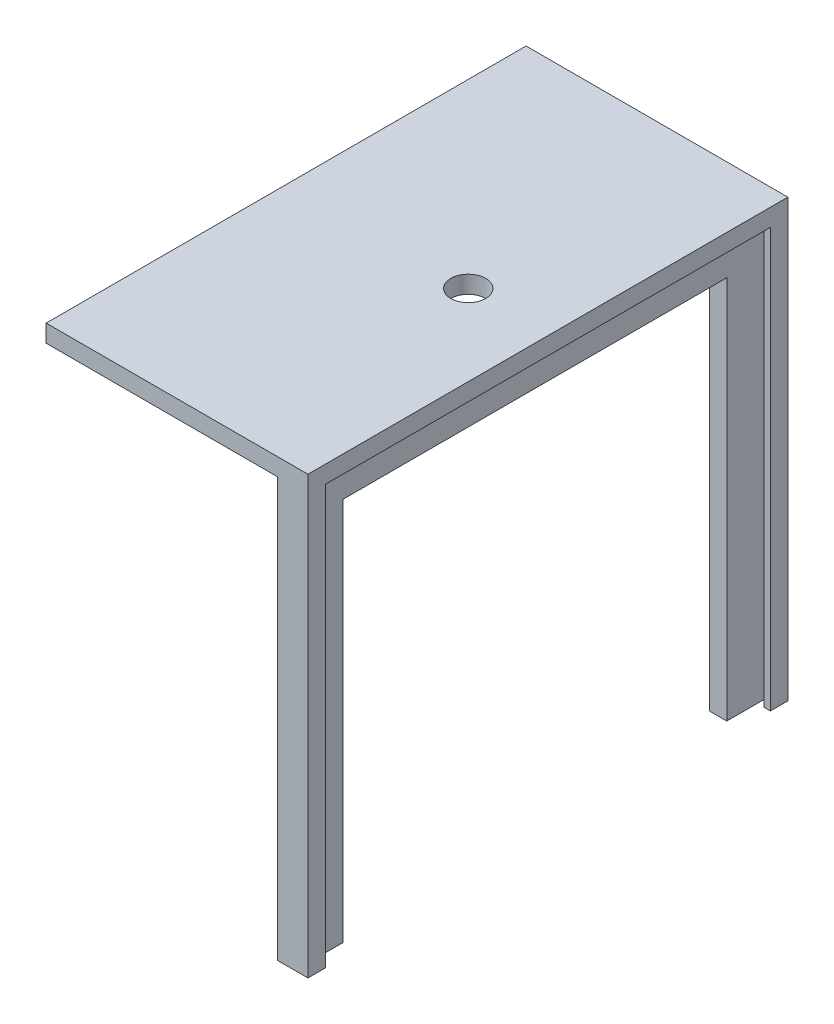
ISO-10303-21;
HEADER;
FILE_DESCRIPTION(('STEP AP214'),'2;1');
FILE_NAME('part.step','',(''),(''),'','','');
FILE_SCHEMA(('AUTOMOTIVE_DESIGN { 1 0 10303 214 1 1 1 1 }'));
ENDSEC;
DATA;
#1=APPLICATION_CONTEXT('core data for automotive mechanical design processes');
#2=APPLICATION_PROTOCOL_DEFINITION('international standard','automotive_design',2000,#1);
#3=PRODUCT_CONTEXT('',#1,'mechanical');
#4=PRODUCT('Part','Part','',(#3));
#5=PRODUCT_RELATED_PRODUCT_CATEGORY('part','',(#4));
#6=PRODUCT_DEFINITION_FORMATION('','',#4);
#7=PRODUCT_DEFINITION_CONTEXT('part definition',#1,'design');
#8=PRODUCT_DEFINITION('design','',#6,#7);
#9=PRODUCT_DEFINITION_SHAPE('','',#8);
#10=(LENGTH_UNIT() NAMED_UNIT(*) SI_UNIT(.MILLI.,.METRE.));
#11=(NAMED_UNIT(*) PLANE_ANGLE_UNIT() SI_UNIT($,.RADIAN.));
#12=(NAMED_UNIT(*) SI_UNIT($,.STERADIAN.) SOLID_ANGLE_UNIT());
#13=UNCERTAINTY_MEASURE_WITH_UNIT(LENGTH_MEASURE(1.E-05),#10,'distance_accuracy_value','');
#14=(GEOMETRIC_REPRESENTATION_CONTEXT(3) GLOBAL_UNCERTAINTY_ASSIGNED_CONTEXT((#13)) GLOBAL_UNIT_ASSIGNED_CONTEXT((#10,
#11,#12)) REPRESENTATION_CONTEXT('',''));
#15=CARTESIAN_POINT('',(0.,0.,0.));
#16=DIRECTION('',(0.,0.,1.));
#17=DIRECTION('',(1.,0.,0.));
#18=AXIS2_PLACEMENT_3D('',#15,#16,#17);
#19=CARTESIAN_POINT('',(20.6200000000001,4.,-55.));
#20=DIRECTION('',(-1.,0.,0.));
#21=DIRECTION('',(0.,0.,1.));
#22=AXIS2_PLACEMENT_3D('',#19,#20,#21);
#23=PLANE('',#22);
#24=DIRECTION('',(0.,0.,-1.));
#25=VECTOR('',#24,1.);
#26=CARTESIAN_POINT('',(20.6200000000001,2.,55.));
#27=LINE('',#26,#25);
#28=CARTESIAN_POINT('',(20.6200000000001,2.,53.));
#29=VERTEX_POINT('',#28);
#30=CARTESIAN_POINT('',(20.6200000000001,2.,-53.));
#31=VERTEX_POINT('',#30);
#32=EDGE_CURVE('E312',#29,#31,#27,.T.);
#33=ORIENTED_EDGE('',*,*,#32,.F.);
#34=DIRECTION('',(0.,1.,0.));
#35=VECTOR('',#34,1.);
#36=CARTESIAN_POINT('',(20.6200000000001,-96.,53.));
#37=LINE('',#36,#35);
#38=CARTESIAN_POINT('',(20.6200000000001,-96.,53.));
#39=VERTEX_POINT('',#38);
#40=EDGE_CURVE('E61',#39,#29,#37,.T.);
#41=ORIENTED_EDGE('',*,*,#40,.F.);
#42=DIRECTION('',(0.,0.,1.));
#43=VECTOR('',#42,1.);
#44=CARTESIAN_POINT('',(20.6200000000001,-96.,55.));
#45=LINE('',#44,#43);
#46=CARTESIAN_POINT('',(20.6200000000001,-96.,44.));
#47=VERTEX_POINT('',#46);
#48=EDGE_CURVE('E499',#47,#39,#45,.T.);
#49=ORIENTED_EDGE('',*,*,#48,.F.);
#50=DIRECTION('',(0.,-1.,0.));
#51=VECTOR('',#50,1.);
#52=CARTESIAN_POINT('',(20.6200000000001,-96.,44.));
#53=LINE('',#52,#51);
#54=CARTESIAN_POINT('',(20.6200000000001,-8.00000000000001,44.));
#55=VERTEX_POINT('',#54);
#56=EDGE_CURVE('E337',#55,#47,#53,.T.);
#57=ORIENTED_EDGE('',*,*,#56,.F.);
#58=DIRECTION('',(0.,0.,1.));
#59=VECTOR('',#58,1.);
#60=CARTESIAN_POINT('',(20.6200000000001,-8.00000000000001,44.));
#61=LINE('',#60,#59);
#62=CARTESIAN_POINT('',(20.6200000000001,-8.00000000000001,-44.));
#63=VERTEX_POINT('',#62);
#64=EDGE_CURVE('E339',#63,#55,#61,.T.);
#65=ORIENTED_EDGE('',*,*,#64,.F.);
#66=DIRECTION('',(0.,1.,0.));
#67=VECTOR('',#66,1.);
#68=CARTESIAN_POINT('',(20.6200000000001,-96.,-44.));
#69=LINE('',#68,#67);
#70=CARTESIAN_POINT('',(20.6200000000001,-96.,-44.));
#71=VERTEX_POINT('',#70);
#72=EDGE_CURVE('E344',#71,#63,#69,.T.);
#73=ORIENTED_EDGE('',*,*,#72,.F.);
#74=CARTESIAN_POINT('',(20.6200000000001,-96.,-53.));
#75=VERTEX_POINT('',#74);
#76=EDGE_CURVE('E479',#75,#71,#45,.T.);
#77=ORIENTED_EDGE('',*,*,#76,.F.);
#78=DIRECTION('',(0.,1.,0.));
#79=VECTOR('',#78,1.);
#80=CARTESIAN_POINT('',(20.6200000000001,-96.,-53.));
#81=LINE('',#80,#79);
#82=EDGE_CURVE('E284',#75,#31,#81,.T.);
#83=ORIENTED_EDGE('',*,*,#82,.T.);
#84=EDGE_LOOP('',(#33,#41,#49,#57,#65,#73,#77,#83));
#85=FACE_BOUND('',#84,.T.);
#86=ADVANCED_FACE('F45',(#85),#23,.F.);
#87=CARTESIAN_POINT('',(27.7350478368514,-96.,-55.));
#88=DIRECTION('',(0.,-1.,0.));
#89=DIRECTION('',(-1.,0.,0.));
#90=AXIS2_PLACEMENT_3D('',#87,#88,#89);
#91=PLANE('',#90);
#92=DIRECTION('',(1.,0.,0.));
#93=VECTOR('',#92,1.);
#94=CARTESIAN_POINT('',(-36.3809999999999,-96.,44.));
#95=LINE('',#94,#93);
#96=CARTESIAN_POINT('',(16.62,-96.,44.));
#97=VERTEX_POINT('',#96);
#98=EDGE_CURVE('E329',#97,#47,#95,.T.);
#99=ORIENTED_EDGE('',*,*,#98,.T.);
#100=ORIENTED_EDGE('',*,*,#48,.T.);
#101=DIRECTION('',(-1.,0.,0.));
#102=VECTOR('',#101,1.);
#103=CARTESIAN_POINT('',(20.6200000000001,-96.,53.));
#104=LINE('',#103,#102);
#105=CARTESIAN_POINT('',(22.1200000000001,-96.,53.));
#106=VERTEX_POINT('',#105);
#107=EDGE_CURVE('E244',#106,#39,#104,.T.);
#108=ORIENTED_EDGE('',*,*,#107,.F.);
#109=DIRECTION('',(0.,0.,1.));
#110=VECTOR('',#109,1.);
#111=CARTESIAN_POINT('',(22.1200000000001,-96.,53.));
#112=LINE('',#111,#110);
#113=CARTESIAN_POINT('',(22.1200000000001,-96.,51.));
#114=VERTEX_POINT('',#113);
#115=EDGE_CURVE('E224',#114,#106,#112,.T.);
#116=ORIENTED_EDGE('',*,*,#115,.F.);
#117=DIRECTION('',(-1.,0.,0.));
#118=VECTOR('',#117,1.);
#119=CARTESIAN_POINT('',(22.1200000000001,-96.,51.));
#120=LINE('',#119,#118);
#121=CARTESIAN_POINT('',(23.6200000000001,-96.,51.));
#122=VERTEX_POINT('',#121);
#123=EDGE_CURVE('E241',#122,#114,#120,.T.);
#124=ORIENTED_EDGE('',*,*,#123,.F.);
#125=DIRECTION('',(0.,0.,-1.));
#126=VECTOR('',#125,1.);
#127=CARTESIAN_POINT('',(23.6200000000001,-96.,51.));
#128=LINE('',#127,#126);
#129=CARTESIAN_POINT('',(23.6200000000001,-96.,55.));
#130=VERTEX_POINT('',#129);
#131=EDGE_CURVE('E233',#130,#122,#128,.T.);
#132=ORIENTED_EDGE('',*,*,#131,.F.);
#133=DIRECTION('',(-1.,0.,0.));
#134=VECTOR('',#133,1.);
#135=CARTESIAN_POINT('',(20.6200000000001,-96.,55.));
#136=LINE('',#135,#134);
#137=CARTESIAN_POINT('',(16.62,-96.,55.));
#138=VERTEX_POINT('',#137);
#139=EDGE_CURVE('E475',#130,#138,#136,.T.);
#140=ORIENTED_EDGE('',*,*,#139,.T.);
#141=DIRECTION('',(0.,0.,-1.));
#142=VECTOR('',#141,1.);
#143=CARTESIAN_POINT('',(16.62,-96.,55.));
#144=LINE('',#143,#142);
#145=EDGE_CURVE('E480',#138,#97,#144,.T.);
#146=ORIENTED_EDGE('',*,*,#145,.T.);
#147=EDGE_LOOP('',(#99,#100,#108,#116,#124,#132,#140,#146));
#148=FACE_BOUND('',#147,.T.);
#149=ADVANCED_FACE('F239',(#148),#91,.T.);
#150=CARTESIAN_POINT('',(0.,0.,0.));
#151=DIRECTION('',(0.,1.,0.));
#152=DIRECTION('',(0.,0.,1.));
#153=AXIS2_PLACEMENT_3D('',#150,#151,#152);
#154=PLANE('',#153);
#155=CARTESIAN_POINT('',(5.12000000000001,0.,-0.250000000000028));
#156=DIRECTION('',(0.,1.,0.));
#157=DIRECTION('',(0.,0.,1.));
#158=AXIS2_PLACEMENT_3D('',#155,#156,#157);
#159=CIRCLE('',#158,4.);
#160=CARTESIAN_POINT('',(5.12000000000001,0.,3.74999999999997));
#161=VERTEX_POINT('',#160);
#162=EDGE_CURVE('E368',#161,#161,#159,.F.);
#163=ORIENTED_EDGE('',*,*,#162,.F.);
#164=EDGE_LOOP('',(#163));
#165=FACE_BOUND('',#164,.T.);
#166=DIRECTION('',(-1.,0.,0.));
#167=VECTOR('',#166,1.);
#168=CARTESIAN_POINT('',(-28.3799999999999,0.,-35.));
#169=LINE('',#168,#167);
#170=CARTESIAN_POINT('',(-28.3799999999999,0.,-35.));
#171=VERTEX_POINT('',#170);
#172=CARTESIAN_POINT('',(-32.3799999999999,0.,-35.));
#173=VERTEX_POINT('',#172);
#174=EDGE_CURVE('E470',#171,#173,#169,.T.);
#175=ORIENTED_EDGE('',*,*,#174,.F.);
#176=DIRECTION('',(0.,0.,1.));
#177=VECTOR('',#176,1.);
#178=CARTESIAN_POINT('',(-28.3799999999999,0.,-45.));
#179=LINE('',#178,#177);
#180=CARTESIAN_POINT('',(-28.3799999999999,0.,-45.));
#181=VERTEX_POINT('',#180);
#182=EDGE_CURVE('E433',#181,#171,#179,.T.);
#183=ORIENTED_EDGE('',*,*,#182,.F.);
#184=DIRECTION('',(-1.,0.,0.));
#185=VECTOR('',#184,1.);
#186=CARTESIAN_POINT('',(-28.3799999999999,0.,-45.));
#187=LINE('',#186,#185);
#188=CARTESIAN_POINT('',(-32.3799999999999,0.,-45.));
#189=VERTEX_POINT('',#188);
#190=EDGE_CURVE('E448',#181,#189,#187,.T.);
#191=ORIENTED_EDGE('',*,*,#190,.T.);
#192=DIRECTION('',(0.,0.,1.));
#193=VECTOR('',#192,1.);
#194=CARTESIAN_POINT('',(-32.3799999999999,0.,-45.));
#195=LINE('',#194,#193);
#196=EDGE_CURVE('E429',#189,#173,#195,.T.);
#197=ORIENTED_EDGE('',*,*,#196,.T.);
#198=EDGE_LOOP('',(#175,#183,#191,#197));
#199=FACE_BOUND('',#198,.T.);
#200=DIRECTION('',(0.,0.,-1.));
#201=VECTOR('',#200,1.);
#202=CARTESIAN_POINT('',(16.62,0.,55.));
#203=LINE('',#202,#201);
#204=CARTESIAN_POINT('',(16.62,0.,55.));
#205=VERTEX_POINT('',#204);
#206=CARTESIAN_POINT('',(16.6200000000001,0.,-55.));
#207=VERTEX_POINT('',#206);
#208=EDGE_CURVE('E488',#205,#207,#203,.T.);
#209=ORIENTED_EDGE('',*,*,#208,.F.);
#210=DIRECTION('',(1.,0.,0.));
#211=VECTOR('',#210,1.);
#212=CARTESIAN_POINT('',(-36.3799999999999,0.,55.));
#213=LINE('',#212,#211);
#214=CARTESIAN_POINT('',(-36.3799999999999,0.,55.));
#215=VERTEX_POINT('',#214);
#216=EDGE_CURVE('E516',#215,#205,#213,.T.);
#217=ORIENTED_EDGE('',*,*,#216,.F.);
#218=DIRECTION('',(0.,0.,1.));
#219=VECTOR('',#218,1.);
#220=CARTESIAN_POINT('',(-36.3799999999999,0.,-55.));
#221=LINE('',#220,#219);
#222=CARTESIAN_POINT('',(-36.3799999999999,0.,-55.));
#223=VERTEX_POINT('',#222);
#224=EDGE_CURVE('E487',#223,#215,#221,.T.);
#225=ORIENTED_EDGE('',*,*,#224,.F.);
#226=DIRECTION('',(-1.,0.,0.));
#227=VECTOR('',#226,1.);
#228=CARTESIAN_POINT('',(-36.3799999999999,0.,-55.));
#229=LINE('',#228,#227);
#230=EDGE_CURVE('E507',#207,#223,#229,.T.);
#231=ORIENTED_EDGE('',*,*,#230,.F.);
#232=EDGE_LOOP('',(#209,#217,#225,#231));
#233=FACE_BOUND('',#232,.T.);
#234=DIRECTION('',(-1.,0.,0.));
#235=VECTOR('',#234,1.);
#236=CARTESIAN_POINT('',(-28.3799999999999,0.,35.));
#237=LINE('',#236,#235);
#238=CARTESIAN_POINT('',(-28.3799999999999,0.,35.));
#239=VERTEX_POINT('',#238);
#240=CARTESIAN_POINT('',(-32.3799999999999,0.,35.));
#241=VERTEX_POINT('',#240);
#242=EDGE_CURVE('E417',#239,#241,#237,.T.);
#243=ORIENTED_EDGE('',*,*,#242,.T.);
#244=DIRECTION('',(0.,0.,1.));
#245=VECTOR('',#244,1.);
#246=CARTESIAN_POINT('',(-32.3799999999999,0.,45.));
#247=LINE('',#246,#245);
#248=CARTESIAN_POINT('',(-32.3799999999999,0.,45.));
#249=VERTEX_POINT('',#248);
#250=EDGE_CURVE('E405',#241,#249,#247,.T.);
#251=ORIENTED_EDGE('',*,*,#250,.T.);
#252=DIRECTION('',(-1.,0.,0.));
#253=VECTOR('',#252,1.);
#254=CARTESIAN_POINT('',(-28.3799999999999,0.,45.));
#255=LINE('',#254,#253);
#256=CARTESIAN_POINT('',(-28.3799999999999,0.,45.));
#257=VERTEX_POINT('',#256);
#258=EDGE_CURVE('E413',#257,#249,#255,.T.);
#259=ORIENTED_EDGE('',*,*,#258,.F.);
#260=DIRECTION('',(0.,0.,1.));
#261=VECTOR('',#260,1.);
#262=CARTESIAN_POINT('',(-28.3799999999999,0.,45.));
#263=LINE('',#262,#261);
#264=EDGE_CURVE('E390',#239,#257,#263,.T.);
#265=ORIENTED_EDGE('',*,*,#264,.F.);
#266=EDGE_LOOP('',(#243,#251,#259,#265));
#267=FACE_BOUND('',#266,.T.);
#268=ADVANCED_FACE('F531',(#165,#199,#233,#267),#154,.F.);
#269=CARTESIAN_POINT('',(-36.3799999999999,4.,-55.));
#270=DIRECTION('',(1.,0.,0.));
#271=DIRECTION('',(0.,0.,-1.));
#272=AXIS2_PLACEMENT_3D('',#269,#270,#271);
#273=PLANE('',#272);
#274=ORIENTED_EDGE('',*,*,#224,.T.);
#275=DIRECTION('',(0.,-1.,0.));
#276=VECTOR('',#275,1.);
#277=CARTESIAN_POINT('',(-36.3799999999999,4.,55.));
#278=LINE('',#277,#276);
#279=CARTESIAN_POINT('',(-36.3799999999999,4.,55.));
#280=VERTEX_POINT('',#279);
#281=EDGE_CURVE('E11',#280,#215,#278,.T.);
#282=ORIENTED_EDGE('',*,*,#281,.F.);
#283=DIRECTION('',(0.,0.,1.));
#284=VECTOR('',#283,1.);
#285=CARTESIAN_POINT('',(-36.3799999999999,4.,-55.));
#286=LINE('',#285,#284);
#287=CARTESIAN_POINT('',(-36.3799999999999,4.,-55.));
#288=VERTEX_POINT('',#287);
#289=EDGE_CURVE('E502',#288,#280,#286,.T.);
#290=ORIENTED_EDGE('',*,*,#289,.F.);
#291=DIRECTION('',(0.,-1.,0.));
#292=VECTOR('',#291,1.);
#293=CARTESIAN_POINT('',(-36.3799999999999,4.,-55.));
#294=LINE('',#293,#292);
#295=EDGE_CURVE('E54',#288,#223,#294,.T.);
#296=ORIENTED_EDGE('',*,*,#295,.T.);
#297=EDGE_LOOP('',(#274,#282,#290,#296));
#298=FACE_BOUND('',#297,.T.);
#299=ADVANCED_FACE('F47',(#298),#273,.F.);
#300=CARTESIAN_POINT('',(-36.3799999999999,4.,55.));
#301=DIRECTION('',(0.,0.,-1.));
#302=DIRECTION('',(-1.,0.,0.));
#303=AXIS2_PLACEMENT_3D('',#300,#301,#302);
#304=PLANE('',#303);
#305=ORIENTED_EDGE('',*,*,#139,.F.);
#306=DIRECTION('',(0.,1.,0.));
#307=VECTOR('',#306,1.);
#308=CARTESIAN_POINT('',(23.6200000000001,4.,55.));
#309=LINE('',#308,#307);
#310=CARTESIAN_POINT('',(23.6200000000001,4.,55.));
#311=VERTEX_POINT('',#310);
#312=EDGE_CURVE('E308',#130,#311,#309,.T.);
#313=ORIENTED_EDGE('',*,*,#312,.T.);
#314=DIRECTION('',(1.,0.,0.));
#315=VECTOR('',#314,1.);
#316=CARTESIAN_POINT('',(-36.3799999999999,4.,55.));
#317=LINE('',#316,#315);
#318=EDGE_CURVE('E506',#280,#311,#317,.T.);
#319=ORIENTED_EDGE('',*,*,#318,.F.);
#320=ORIENTED_EDGE('',*,*,#281,.T.);
#321=ORIENTED_EDGE('',*,*,#216,.T.);
#322=DIRECTION('',(0.,1.,0.));
#323=VECTOR('',#322,1.);
#324=CARTESIAN_POINT('',(16.62,-206.072703246536,55.));
#325=LINE('',#324,#323);
#326=EDGE_CURVE('E474',#138,#205,#325,.T.);
#327=ORIENTED_EDGE('',*,*,#326,.F.);
#328=EDGE_LOOP('',(#305,#313,#319,#320,#321,#327));
#329=FACE_BOUND('',#328,.T.);
#330=ADVANCED_FACE('F535',(#329),#304,.F.);
#331=CARTESIAN_POINT('',(-36.3799999999999,4.,-55.));
#332=DIRECTION('',(0.,0.,1.));
#333=DIRECTION('',(1.,0.,0.));
#334=AXIS2_PLACEMENT_3D('',#331,#332,#333);
#335=PLANE('',#334);
#336=ORIENTED_EDGE('',*,*,#295,.F.);
#337=DIRECTION('',(-1.,0.,0.));
#338=VECTOR('',#337,1.);
#339=CARTESIAN_POINT('',(-36.3799999999999,4.,-55.));
#340=LINE('',#339,#338);
#341=CARTESIAN_POINT('',(23.6200000000001,4.,-55.));
#342=VERTEX_POINT('',#341);
#343=EDGE_CURVE('E510',#342,#288,#340,.T.);
#344=ORIENTED_EDGE('',*,*,#343,.F.);
#345=DIRECTION('',(0.,1.,0.));
#346=VECTOR('',#345,1.);
#347=CARTESIAN_POINT('',(23.6200000000001,4.,-55.));
#348=LINE('',#347,#346);
#349=CARTESIAN_POINT('',(23.6200000000001,-96.,-55.));
#350=VERTEX_POINT('',#349);
#351=EDGE_CURVE('E307',#350,#342,#348,.T.);
#352=ORIENTED_EDGE('',*,*,#351,.F.);
#353=DIRECTION('',(1.,0.,0.));
#354=VECTOR('',#353,1.);
#355=CARTESIAN_POINT('',(20.6200000000001,-96.,-55.));
#356=LINE('',#355,#354);
#357=CARTESIAN_POINT('',(16.6200000000001,-96.,-55.));
#358=VERTEX_POINT('',#357);
#359=EDGE_CURVE('E484',#358,#350,#356,.T.);
#360=ORIENTED_EDGE('',*,*,#359,.F.);
#361=DIRECTION('',(0.,1.,0.));
#362=VECTOR('',#361,1.);
#363=CARTESIAN_POINT('',(16.6200000000001,-206.072703246536,-55.));
#364=LINE('',#363,#362);
#365=EDGE_CURVE('E492',#358,#207,#364,.T.);
#366=ORIENTED_EDGE('',*,*,#365,.T.);
#367=ORIENTED_EDGE('',*,*,#230,.T.);
#368=EDGE_LOOP('',(#336,#344,#352,#360,#366,#367));
#369=FACE_BOUND('',#368,.T.);
#370=ADVANCED_FACE('F542',(#369),#335,.F.);
#371=CARTESIAN_POINT('',(0.,4.,0.));
#372=DIRECTION('',(0.,1.,0.));
#373=DIRECTION('',(0.,0.,1.));
#374=AXIS2_PLACEMENT_3D('',#371,#372,#373);
#375=PLANE('',#374);
#376=ORIENTED_EDGE('',*,*,#318,.T.);
#377=DIRECTION('',(0.,0.,-1.));
#378=VECTOR('',#377,1.);
#379=CARTESIAN_POINT('',(23.6200000000001,4.,55.));
#380=LINE('',#379,#378);
#381=EDGE_CURVE('E318',#311,#342,#380,.T.);
#382=ORIENTED_EDGE('',*,*,#381,.T.);
#383=ORIENTED_EDGE('',*,*,#343,.T.);
#384=ORIENTED_EDGE('',*,*,#289,.T.);
#385=EDGE_LOOP('',(#376,#382,#383,#384));
#386=FACE_BOUND('',#385,.T.);
#387=CARTESIAN_POINT('',(5.12000000000001,4.,-0.250000000000028));
#388=DIRECTION('',(0.,1.,0.));
#389=DIRECTION('',(0.,0.,1.));
#390=AXIS2_PLACEMENT_3D('',#387,#388,#389);
#391=CIRCLE('',#390,4.);
#392=CARTESIAN_POINT('',(5.12000000000001,4.,3.74999999999997));
#393=VERTEX_POINT('',#392);
#394=EDGE_CURVE('E360',#393,#393,#391,.T.);
#395=ORIENTED_EDGE('',*,*,#394,.F.);
#396=EDGE_LOOP('',(#395));
#397=FACE_BOUND('',#396,.T.);
#398=ADVANCED_FACE('F539',(#386,#397),#375,.T.);
#399=CARTESIAN_POINT('',(16.62,-206.072703246536,55.));
#400=DIRECTION('',(1.,0.,0.));
#401=DIRECTION('',(0.,0.,-1.));
#402=AXIS2_PLACEMENT_3D('',#399,#400,#401);
#403=PLANE('',#402);
#404=DIRECTION('',(0.,0.,-1.));
#405=VECTOR('',#404,1.);
#406=CARTESIAN_POINT('',(16.62,-8.00000000000001,44.));
#407=LINE('',#406,#405);
#408=CARTESIAN_POINT('',(16.62,-8.00000000000001,44.));
#409=VERTEX_POINT('',#408);
#410=CARTESIAN_POINT('',(16.6200000000001,-8.00000000000001,-44.));
#411=VERTEX_POINT('',#410);
#412=EDGE_CURVE('E353',#409,#411,#407,.T.);
#413=ORIENTED_EDGE('',*,*,#412,.F.);
#414=DIRECTION('',(0.,1.,0.));
#415=VECTOR('',#414,1.);
#416=CARTESIAN_POINT('',(16.62,-96.,44.));
#417=LINE('',#416,#415);
#418=EDGE_CURVE('E343',#97,#409,#417,.T.);
#419=ORIENTED_EDGE('',*,*,#418,.F.);
#420=ORIENTED_EDGE('',*,*,#145,.F.);
#421=ORIENTED_EDGE('',*,*,#326,.T.);
#422=ORIENTED_EDGE('',*,*,#208,.T.);
#423=ORIENTED_EDGE('',*,*,#365,.F.);
#424=CARTESIAN_POINT('',(16.6200000000001,-96.,-44.));
#425=VERTEX_POINT('',#424);
#426=EDGE_CURVE('E478',#425,#358,#144,.T.);
#427=ORIENTED_EDGE('',*,*,#426,.F.);
#428=DIRECTION('',(0.,-1.,0.));
#429=VECTOR('',#428,1.);
#430=CARTESIAN_POINT('',(16.6200000000001,-96.,-44.));
#431=LINE('',#430,#429);
#432=EDGE_CURVE('E357',#411,#425,#431,.T.);
#433=ORIENTED_EDGE('',*,*,#432,.F.);
#434=EDGE_LOOP('',(#413,#419,#420,#421,#422,#423,#427,#433));
#435=FACE_BOUND('',#434,.T.);
#436=ADVANCED_FACE('F568',(#435),#403,.F.);
#437=DIRECTION('',(1.,0.,0.));
#438=VECTOR('',#437,1.);
#439=CARTESIAN_POINT('',(-36.3809999999999,-96.,-44.));
#440=LINE('',#439,#438);
#441=EDGE_CURVE('E333',#425,#71,#440,.T.);
#442=ORIENTED_EDGE('',*,*,#441,.F.);
#443=ORIENTED_EDGE('',*,*,#426,.T.);
#444=ORIENTED_EDGE('',*,*,#359,.T.);
#445=DIRECTION('',(0.,0.,-1.));
#446=VECTOR('',#445,1.);
#447=CARTESIAN_POINT('',(23.6200000000001,-96.,-51.));
#448=LINE('',#447,#446);
#449=CARTESIAN_POINT('',(23.6200000000001,-96.,-51.));
#450=VERTEX_POINT('',#449);
#451=EDGE_CURVE('E268',#450,#350,#448,.T.);
#452=ORIENTED_EDGE('',*,*,#451,.F.);
#453=DIRECTION('',(1.,0.,0.));
#454=VECTOR('',#453,1.);
#455=CARTESIAN_POINT('',(22.1200000000001,-96.,-51.));
#456=LINE('',#455,#454);
#457=CARTESIAN_POINT('',(22.1200000000001,-96.,-51.));
#458=VERTEX_POINT('',#457);
#459=EDGE_CURVE('E280',#458,#450,#456,.T.);
#460=ORIENTED_EDGE('',*,*,#459,.F.);
#461=DIRECTION('',(0.,0.,1.));
#462=VECTOR('',#461,1.);
#463=CARTESIAN_POINT('',(22.1200000000001,-96.,-53.));
#464=LINE('',#463,#462);
#465=CARTESIAN_POINT('',(22.1200000000001,-96.,-53.));
#466=VERTEX_POINT('',#465);
#467=EDGE_CURVE('E276',#466,#458,#464,.T.);
#468=ORIENTED_EDGE('',*,*,#467,.F.);
#469=DIRECTION('',(1.,0.,0.));
#470=VECTOR('',#469,1.);
#471=CARTESIAN_POINT('',(20.6200000000001,-96.,-53.));
#472=LINE('',#471,#470);
#473=EDGE_CURVE('E272',#75,#466,#472,.T.);
#474=ORIENTED_EDGE('',*,*,#473,.F.);
#475=ORIENTED_EDGE('',*,*,#76,.T.);
#476=EDGE_LOOP('',(#442,#443,#444,#452,#460,#468,#474,#475));
#477=FACE_BOUND('',#476,.T.);
#478=ADVANCED_FACE('F550',(#477),#91,.T.);
#479=CARTESIAN_POINT('',(-28.3799999999999,-5.,-40.));
#480=DIRECTION('',(-1.,0.,0.));
#481=DIRECTION('',(0.,0.,1.));
#482=AXIS2_PLACEMENT_3D('',#479,#480,#481);
#483=PLANE('',#482);
#484=ORIENTED_EDGE('',*,*,#182,.T.);
#485=DIRECTION('',(0.,-1.,0.));
#486=VECTOR('',#485,1.);
#487=CARTESIAN_POINT('',(-28.3799999999999,0.,-35.));
#488=LINE('',#487,#486);
#489=CARTESIAN_POINT('',(-28.3799999999999,-5.,-35.));
#490=VERTEX_POINT('',#489);
#491=EDGE_CURVE('E437',#171,#490,#488,.T.);
#492=ORIENTED_EDGE('',*,*,#491,.T.);
#493=CARTESIAN_POINT('',(-28.3799999999999,-5.,-40.));
#494=DIRECTION('',(1.,0.,0.));
#495=DIRECTION('',(0.,0.,1.));
#496=AXIS2_PLACEMENT_3D('',#493,#494,#495);
#497=CIRCLE('',#496,5.);
#498=CARTESIAN_POINT('',(-28.3799999999999,-5.,-45.));
#499=VERTEX_POINT('',#498);
#500=EDGE_CURVE('E441',#490,#499,#497,.T.);
#501=ORIENTED_EDGE('',*,*,#500,.T.);
#502=DIRECTION('',(0.,1.,0.));
#503=VECTOR('',#502,1.);
#504=CARTESIAN_POINT('',(-28.3799999999999,0.,-45.));
#505=LINE('',#504,#503);
#506=EDGE_CURVE('E444',#499,#181,#505,.T.);
#507=ORIENTED_EDGE('',*,*,#506,.T.);
#508=EDGE_LOOP('',(#484,#492,#501,#507));
#509=FACE_BOUND('',#508,.T.);
#510=CARTESIAN_POINT('',(-28.3799999999999,-5.,-40.));
#511=DIRECTION('',(1.,0.,0.));
#512=DIRECTION('',(0.,0.,-1.));
#513=AXIS2_PLACEMENT_3D('',#510,#511,#512);
#514=CIRCLE('',#513,3.41);
#515=CARTESIAN_POINT('',(-28.3799999999999,-5.,-43.41));
#516=VERTEX_POINT('',#515);
#517=EDGE_CURVE('E425',#516,#516,#514,.T.);
#518=ORIENTED_EDGE('',*,*,#517,.F.);
#519=EDGE_LOOP('',(#518));
#520=FACE_BOUND('',#519,.T.);
#521=ADVANCED_FACE('F616',(#509,#520),#483,.F.);
#522=CARTESIAN_POINT('',(-32.3799999999999,-5.,-40.));
#523=DIRECTION('',(-1.,0.,0.));
#524=DIRECTION('',(0.,0.,1.));
#525=AXIS2_PLACEMENT_3D('',#522,#523,#524);
#526=PLANE('',#525);
#527=ORIENTED_EDGE('',*,*,#196,.F.);
#528=DIRECTION('',(0.,1.,0.));
#529=VECTOR('',#528,1.);
#530=CARTESIAN_POINT('',(-32.3799999999999,0.,-45.));
#531=LINE('',#530,#529);
#532=CARTESIAN_POINT('',(-32.3799999999999,-5.,-45.));
#533=VERTEX_POINT('',#532);
#534=EDGE_CURVE('E438',#533,#189,#531,.T.);
#535=ORIENTED_EDGE('',*,*,#534,.F.);
#536=CARTESIAN_POINT('',(-32.3799999999999,-5.,-40.));
#537=DIRECTION('',(1.,0.,0.));
#538=DIRECTION('',(0.,0.,1.));
#539=AXIS2_PLACEMENT_3D('',#536,#537,#538);
#540=CIRCLE('',#539,5.);
#541=CARTESIAN_POINT('',(-32.3799999999999,-5.,-35.));
#542=VERTEX_POINT('',#541);
#543=EDGE_CURVE('E454',#542,#533,#540,.T.);
#544=ORIENTED_EDGE('',*,*,#543,.F.);
#545=DIRECTION('',(0.,-1.,0.));
#546=VECTOR('',#545,1.);
#547=CARTESIAN_POINT('',(-32.3799999999999,0.,-35.));
#548=LINE('',#547,#546);
#549=EDGE_CURVE('E451',#173,#542,#548,.T.);
#550=ORIENTED_EDGE('',*,*,#549,.F.);
#551=EDGE_LOOP('',(#527,#535,#544,#550));
#552=FACE_BOUND('',#551,.T.);
#553=CARTESIAN_POINT('',(-32.3799999999999,-5.,-40.));
#554=DIRECTION('',(1.,0.,0.));
#555=DIRECTION('',(0.,0.,-1.));
#556=AXIS2_PLACEMENT_3D('',#553,#554,#555);
#557=CIRCLE('',#556,3.41);
#558=CARTESIAN_POINT('',(-32.3799999999999,-5.,-43.41));
#559=VERTEX_POINT('',#558);
#560=EDGE_CURVE('E424',#559,#559,#557,.T.);
#561=ORIENTED_EDGE('',*,*,#560,.T.);
#562=EDGE_LOOP('',(#561));
#563=FACE_BOUND('',#562,.T.);
#564=ADVANCED_FACE('F623',(#552,#563),#526,.T.);
#565=CARTESIAN_POINT('',(-28.3799999999999,0.,-35.));
#566=DIRECTION('',(0.,0.,-1.));
#567=DIRECTION('',(-1.,0.,0.));
#568=AXIS2_PLACEMENT_3D('',#565,#566,#567);
#569=PLANE('',#568);
#570=ORIENTED_EDGE('',*,*,#549,.T.);
#571=DIRECTION('',(-1.,0.,0.));
#572=VECTOR('',#571,1.);
#573=CARTESIAN_POINT('',(-28.3799999999999,-5.,-35.));
#574=LINE('',#573,#572);
#575=EDGE_CURVE('E466',#490,#542,#574,.T.);
#576=ORIENTED_EDGE('',*,*,#575,.F.);
#577=ORIENTED_EDGE('',*,*,#491,.F.);
#578=ORIENTED_EDGE('',*,*,#174,.T.);
#579=EDGE_LOOP('',(#570,#576,#577,#578));
#580=FACE_BOUND('',#579,.T.);
#581=ADVANCED_FACE('F619',(#580),#569,.F.);
#582=CARTESIAN_POINT('',(-28.3799999999999,-5.,-40.));
#583=DIRECTION('',(-1.,0.,0.));
#584=DIRECTION('',(0.,0.,1.));
#585=AXIS2_PLACEMENT_3D('',#582,#583,#584);
#586=CYLINDRICAL_SURFACE('',#585,5.);
#587=ORIENTED_EDGE('',*,*,#543,.T.);
#588=DIRECTION('',(-1.,0.,0.));
#589=VECTOR('',#588,1.);
#590=CARTESIAN_POINT('',(-28.3799999999999,-5.,-45.));
#591=LINE('',#590,#589);
#592=EDGE_CURVE('E462',#499,#533,#591,.T.);
#593=ORIENTED_EDGE('',*,*,#592,.F.);
#594=ORIENTED_EDGE('',*,*,#500,.F.);
#595=ORIENTED_EDGE('',*,*,#575,.T.);
#596=EDGE_LOOP('',(#587,#593,#594,#595));
#597=FACE_BOUND('',#596,.T.);
#598=ADVANCED_FACE('F622',(#597),#586,.T.);
#599=CARTESIAN_POINT('',(-28.3799999999999,0.,-45.));
#600=DIRECTION('',(0.,0.,1.));
#601=DIRECTION('',(1.,0.,0.));
#602=AXIS2_PLACEMENT_3D('',#599,#600,#601);
#603=PLANE('',#602);
#604=ORIENTED_EDGE('',*,*,#534,.T.);
#605=ORIENTED_EDGE('',*,*,#190,.F.);
#606=ORIENTED_EDGE('',*,*,#506,.F.);
#607=ORIENTED_EDGE('',*,*,#592,.T.);
#608=EDGE_LOOP('',(#604,#605,#606,#607));
#609=FACE_BOUND('',#608,.T.);
#610=ADVANCED_FACE('F627',(#609),#603,.F.);
#611=CARTESIAN_POINT('',(-28.3799999999999,-5.,-40.));
#612=DIRECTION('',(-1.,0.,0.));
#613=DIRECTION('',(0.,0.,1.));
#614=AXIS2_PLACEMENT_3D('',#611,#612,#613);
#615=CYLINDRICAL_SURFACE('',#614,3.41);
#616=ORIENTED_EDGE('',*,*,#517,.T.);
#617=EDGE_LOOP('',(#616));
#618=FACE_BOUND('',#617,.T.);
#619=ORIENTED_EDGE('',*,*,#560,.F.);
#620=EDGE_LOOP('',(#619));
#621=FACE_BOUND('',#620,.T.);
#622=ADVANCED_FACE('F631',(#618,#621),#615,.F.);
#623=CARTESIAN_POINT('',(-28.3799999999999,-5.,40.));
#624=DIRECTION('',(1.,0.,0.));
#625=DIRECTION('',(0.,0.,-1.));
#626=AXIS2_PLACEMENT_3D('',#623,#624,#625);
#627=PLANE('',#626);
#628=CARTESIAN_POINT('',(-28.3799999999999,-5.,40.));
#629=DIRECTION('',(1.,0.,0.));
#630=DIRECTION('',(0.,0.,-1.));
#631=AXIS2_PLACEMENT_3D('',#628,#629,#630);
#632=CIRCLE('',#631,5.);
#633=CARTESIAN_POINT('',(-28.3799999999999,-5.,45.));
#634=VERTEX_POINT('',#633);
#635=CARTESIAN_POINT('',(-28.3799999999999,-5.,35.));
#636=VERTEX_POINT('',#635);
#637=EDGE_CURVE('E381',#634,#636,#632,.T.);
#638=ORIENTED_EDGE('',*,*,#637,.T.);
#639=DIRECTION('',(0.,1.,0.));
#640=VECTOR('',#639,1.);
#641=CARTESIAN_POINT('',(-28.3799999999999,0.,35.));
#642=LINE('',#641,#640);
#643=EDGE_CURVE('E385',#636,#239,#642,.T.);
#644=ORIENTED_EDGE('',*,*,#643,.T.);
#645=ORIENTED_EDGE('',*,*,#264,.T.);
#646=DIRECTION('',(0.,-1.,0.));
#647=VECTOR('',#646,1.);
#648=CARTESIAN_POINT('',(-28.3799999999999,0.,45.));
#649=LINE('',#648,#647);
#650=EDGE_CURVE('E394',#257,#634,#649,.T.);
#651=ORIENTED_EDGE('',*,*,#650,.T.);
#652=EDGE_LOOP('',(#638,#644,#645,#651));
#653=FACE_BOUND('',#652,.T.);
#654=CARTESIAN_POINT('',(-28.3799999999999,-5.,40.));
#655=DIRECTION('',(1.,0.,0.));
#656=DIRECTION('',(0.,0.,1.));
#657=AXIS2_PLACEMENT_3D('',#654,#655,#656);
#658=CIRCLE('',#657,3.41);
#659=CARTESIAN_POINT('',(-28.3799999999999,-5.,43.41));
#660=VERTEX_POINT('',#659);
#661=EDGE_CURVE('E373',#660,#660,#658,.T.);
#662=ORIENTED_EDGE('',*,*,#661,.F.);
#663=EDGE_LOOP('',(#662));
#664=FACE_BOUND('',#663,.T.);
#665=ADVANCED_FACE('F640',(#653,#664),#627,.T.);
#666=CARTESIAN_POINT('',(-32.3799999999999,-5.,40.));
#667=DIRECTION('',(1.,0.,0.));
#668=DIRECTION('',(0.,0.,-1.));
#669=AXIS2_PLACEMENT_3D('',#666,#667,#668);
#670=PLANE('',#669);
#671=CARTESIAN_POINT('',(-32.3799999999999,-5.,40.));
#672=DIRECTION('',(1.,0.,0.));
#673=DIRECTION('',(0.,0.,-1.));
#674=AXIS2_PLACEMENT_3D('',#671,#672,#673);
#675=CIRCLE('',#674,5.);
#676=CARTESIAN_POINT('',(-32.3799999999999,-5.,45.));
#677=VERTEX_POINT('',#676);
#678=CARTESIAN_POINT('',(-32.3799999999999,-5.,35.));
#679=VERTEX_POINT('',#678);
#680=EDGE_CURVE('E377',#677,#679,#675,.T.);
#681=ORIENTED_EDGE('',*,*,#680,.F.);
#682=DIRECTION('',(0.,-1.,0.));
#683=VECTOR('',#682,1.);
#684=CARTESIAN_POINT('',(-32.3799999999999,0.,45.));
#685=LINE('',#684,#683);
#686=EDGE_CURVE('E386',#249,#677,#685,.T.);
#687=ORIENTED_EDGE('',*,*,#686,.F.);
#688=ORIENTED_EDGE('',*,*,#250,.F.);
#689=DIRECTION('',(0.,1.,0.));
#690=VECTOR('',#689,1.);
#691=CARTESIAN_POINT('',(-32.3799999999999,0.,35.));
#692=LINE('',#691,#690);
#693=EDGE_CURVE('E401',#679,#241,#692,.T.);
#694=ORIENTED_EDGE('',*,*,#693,.F.);
#695=EDGE_LOOP('',(#681,#687,#688,#694));
#696=FACE_BOUND('',#695,.T.);
#697=CARTESIAN_POINT('',(-32.3799999999999,-5.,40.));
#698=DIRECTION('',(1.,0.,0.));
#699=DIRECTION('',(0.,0.,1.));
#700=AXIS2_PLACEMENT_3D('',#697,#698,#699);
#701=CIRCLE('',#700,3.41);
#702=CARTESIAN_POINT('',(-32.3799999999999,-5.,43.41));
#703=VERTEX_POINT('',#702);
#704=EDGE_CURVE('E372',#703,#703,#701,.T.);
#705=ORIENTED_EDGE('',*,*,#704,.T.);
#706=EDGE_LOOP('',(#705));
#707=FACE_BOUND('',#706,.T.);
#708=ADVANCED_FACE('F646',(#696,#707),#670,.F.);
#709=CARTESIAN_POINT('',(-28.3799999999999,-5.,40.));
#710=DIRECTION('',(-1.,0.,0.));
#711=DIRECTION('',(0.,0.,1.));
#712=AXIS2_PLACEMENT_3D('',#709,#710,#711);
#713=CYLINDRICAL_SURFACE('',#712,5.);
#714=ORIENTED_EDGE('',*,*,#680,.T.);
#715=DIRECTION('',(-1.,0.,0.));
#716=VECTOR('',#715,1.);
#717=CARTESIAN_POINT('',(-28.3799999999999,-5.,35.));
#718=LINE('',#717,#716);
#719=EDGE_CURVE('E420',#636,#679,#718,.T.);
#720=ORIENTED_EDGE('',*,*,#719,.F.);
#721=ORIENTED_EDGE('',*,*,#637,.F.);
#722=DIRECTION('',(-1.,0.,0.));
#723=VECTOR('',#722,1.);
#724=CARTESIAN_POINT('',(-28.3799999999999,-5.,45.));
#725=LINE('',#724,#723);
#726=EDGE_CURVE('E397',#634,#677,#725,.T.);
#727=ORIENTED_EDGE('',*,*,#726,.T.);
#728=EDGE_LOOP('',(#714,#720,#721,#727));
#729=FACE_BOUND('',#728,.T.);
#730=ADVANCED_FACE('F642',(#729),#713,.T.);
#731=CARTESIAN_POINT('',(-28.3799999999999,0.,35.));
#732=DIRECTION('',(0.,0.,1.));
#733=DIRECTION('',(1.,0.,0.));
#734=AXIS2_PLACEMENT_3D('',#731,#732,#733);
#735=PLANE('',#734);
#736=ORIENTED_EDGE('',*,*,#693,.T.);
#737=ORIENTED_EDGE('',*,*,#242,.F.);
#738=ORIENTED_EDGE('',*,*,#643,.F.);
#739=ORIENTED_EDGE('',*,*,#719,.T.);
#740=EDGE_LOOP('',(#736,#737,#738,#739));
#741=FACE_BOUND('',#740,.T.);
#742=ADVANCED_FACE('F645',(#741),#735,.F.);
#743=CARTESIAN_POINT('',(-28.3799999999999,0.,45.));
#744=DIRECTION('',(0.,0.,-1.));
#745=DIRECTION('',(-1.,0.,0.));
#746=AXIS2_PLACEMENT_3D('',#743,#744,#745);
#747=PLANE('',#746);
#748=ORIENTED_EDGE('',*,*,#686,.T.);
#749=ORIENTED_EDGE('',*,*,#726,.F.);
#750=ORIENTED_EDGE('',*,*,#650,.F.);
#751=ORIENTED_EDGE('',*,*,#258,.T.);
#752=EDGE_LOOP('',(#748,#749,#750,#751));
#753=FACE_BOUND('',#752,.T.);
#754=ADVANCED_FACE('F650',(#753),#747,.F.);
#755=CARTESIAN_POINT('',(-28.3799999999999,-5.,40.));
#756=DIRECTION('',(-1.,0.,0.));
#757=DIRECTION('',(0.,0.,1.));
#758=AXIS2_PLACEMENT_3D('',#755,#756,#757);
#759=CYLINDRICAL_SURFACE('',#758,3.41);
#760=ORIENTED_EDGE('',*,*,#661,.T.);
#761=EDGE_LOOP('',(#760));
#762=FACE_BOUND('',#761,.T.);
#763=ORIENTED_EDGE('',*,*,#704,.F.);
#764=EDGE_LOOP('',(#763));
#765=FACE_BOUND('',#764,.T.);
#766=ADVANCED_FACE('F654',(#762,#765),#759,.F.);
#767=CARTESIAN_POINT('',(5.12000000000001,-96.001,-0.250000000000028));
#768=DIRECTION('',(0.,1.,0.));
#769=DIRECTION('',(0.,0.,1.));
#770=AXIS2_PLACEMENT_3D('',#767,#768,#769);
#771=CYLINDRICAL_SURFACE('',#770,4.);
#772=ORIENTED_EDGE('',*,*,#394,.T.);
#773=EDGE_LOOP('',(#772));
#774=FACE_BOUND('',#773,.T.);
#775=ORIENTED_EDGE('',*,*,#162,.T.);
#776=EDGE_LOOP('',(#775));
#777=FACE_BOUND('',#776,.T.);
#778=ADVANCED_FACE('F663',(#774,#777),#771,.F.);
#779=CARTESIAN_POINT('',(-36.3809999999999,-96.,44.));
#780=DIRECTION('',(0.,0.,1.));
#781=DIRECTION('',(1.,0.,0.));
#782=AXIS2_PLACEMENT_3D('',#779,#780,#781);
#783=PLANE('',#782);
#784=ORIENTED_EDGE('',*,*,#418,.T.);
#785=DIRECTION('',(1.,0.,0.));
#786=VECTOR('',#785,1.);
#787=CARTESIAN_POINT('',(-36.3809999999999,-8.00000000000001,44.));
#788=LINE('',#787,#786);
#789=EDGE_CURVE('E332',#409,#55,#788,.T.);
#790=ORIENTED_EDGE('',*,*,#789,.T.);
#791=ORIENTED_EDGE('',*,*,#56,.T.);
#792=ORIENTED_EDGE('',*,*,#98,.F.);
#793=EDGE_LOOP('',(#784,#790,#791,#792));
#794=FACE_BOUND('',#793,.T.);
#795=ADVANCED_FACE('F666',(#794),#783,.F.);
#796=CARTESIAN_POINT('',(-36.3809999999999,-8.00000000000001,44.));
#797=DIRECTION('',(0.,1.,0.));
#798=DIRECTION('',(0.,0.,1.));
#799=AXIS2_PLACEMENT_3D('',#796,#797,#798);
#800=PLANE('',#799);
#801=ORIENTED_EDGE('',*,*,#412,.T.);
#802=DIRECTION('',(1.,0.,0.));
#803=VECTOR('',#802,1.);
#804=CARTESIAN_POINT('',(-36.3809999999999,-8.00000000000001,-44.));
#805=LINE('',#804,#803);
#806=EDGE_CURVE('E338',#411,#63,#805,.T.);
#807=ORIENTED_EDGE('',*,*,#806,.T.);
#808=ORIENTED_EDGE('',*,*,#64,.T.);
#809=ORIENTED_EDGE('',*,*,#789,.F.);
#810=EDGE_LOOP('',(#801,#807,#808,#809));
#811=FACE_BOUND('',#810,.T.);
#812=ADVANCED_FACE('F586',(#811),#800,.F.);
#813=CARTESIAN_POINT('',(-36.3809999999999,-96.,-44.));
#814=DIRECTION('',(0.,0.,-1.));
#815=DIRECTION('',(-1.,0.,0.));
#816=AXIS2_PLACEMENT_3D('',#813,#814,#815);
#817=PLANE('',#816);
#818=ORIENTED_EDGE('',*,*,#432,.T.);
#819=ORIENTED_EDGE('',*,*,#441,.T.);
#820=ORIENTED_EDGE('',*,*,#72,.T.);
#821=ORIENTED_EDGE('',*,*,#806,.F.);
#822=EDGE_LOOP('',(#818,#819,#820,#821));
#823=FACE_BOUND('',#822,.T.);
#824=ADVANCED_FACE('F564',(#823),#817,.F.);
#825=CARTESIAN_POINT('',(22.1200000000001,2.,55.));
#826=DIRECTION('',(0.,1.,0.));
#827=DIRECTION('',(-1.,0.,0.));
#828=AXIS2_PLACEMENT_3D('',#825,#826,#827);
#829=PLANE('',#828);
#830=DIRECTION('',(0.,0.,-1.));
#831=VECTOR('',#830,1.);
#832=CARTESIAN_POINT('',(22.1200000000001,2.,55.));
#833=LINE('',#832,#831);
#834=CARTESIAN_POINT('',(22.1200000000001,2.,53.));
#835=VERTEX_POINT('',#834);
#836=CARTESIAN_POINT('',(22.1200000000001,2.,-53.));
#837=VERTEX_POINT('',#836);
#838=EDGE_CURVE('E326',#835,#837,#833,.T.);
#839=ORIENTED_EDGE('',*,*,#838,.F.);
#840=DIRECTION('',(-1.,0.,0.));
#841=VECTOR('',#840,1.);
#842=CARTESIAN_POINT('',(22.1200000000001,2.,53.));
#843=LINE('',#842,#841);
#844=EDGE_CURVE('E69',#835,#29,#843,.T.);
#845=ORIENTED_EDGE('',*,*,#844,.T.);
#846=ORIENTED_EDGE('',*,*,#32,.T.);
#847=DIRECTION('',(1.,0.,0.));
#848=VECTOR('',#847,1.);
#849=CARTESIAN_POINT('',(22.1200000000001,2.,-53.));
#850=LINE('',#849,#848);
#851=EDGE_CURVE('E303',#31,#837,#850,.T.);
#852=ORIENTED_EDGE('',*,*,#851,.T.);
#853=EDGE_LOOP('',(#839,#845,#846,#852));
#854=FACE_BOUND('',#853,.T.);
#855=ADVANCED_FACE('F576',(#854),#829,.F.);
#856=CARTESIAN_POINT('',(22.1200000000001,0.,55.));
#857=DIRECTION('',(1.,0.,0.));
#858=DIRECTION('',(0.,0.,-1.));
#859=AXIS2_PLACEMENT_3D('',#856,#857,#858);
#860=PLANE('',#859);
#861=DIRECTION('',(0.,0.,-1.));
#862=VECTOR('',#861,1.);
#863=CARTESIAN_POINT('',(22.1200000000001,0.,55.));
#864=LINE('',#863,#862);
#865=CARTESIAN_POINT('',(22.1200000000001,0.,51.));
#866=VERTEX_POINT('',#865);
#867=CARTESIAN_POINT('',(22.1200000000001,0.,-51.));
#868=VERTEX_POINT('',#867);
#869=EDGE_CURVE('E226',#866,#868,#864,.T.);
#870=ORIENTED_EDGE('',*,*,#869,.F.);
#871=DIRECTION('',(0.,1.,0.));
#872=VECTOR('',#871,1.);
#873=CARTESIAN_POINT('',(22.1200000000001,-96.,51.));
#874=LINE('',#873,#872);
#875=EDGE_CURVE('E221',#114,#866,#874,.T.);
#876=ORIENTED_EDGE('',*,*,#875,.F.);
#877=ORIENTED_EDGE('',*,*,#115,.T.);
#878=DIRECTION('',(0.,1.,0.));
#879=VECTOR('',#878,1.);
#880=CARTESIAN_POINT('',(22.1200000000001,-96.,53.));
#881=LINE('',#880,#879);
#882=EDGE_CURVE('E232',#106,#835,#881,.T.);
#883=ORIENTED_EDGE('',*,*,#882,.T.);
#884=ORIENTED_EDGE('',*,*,#838,.T.);
#885=DIRECTION('',(0.,1.,0.));
#886=VECTOR('',#885,1.);
#887=CARTESIAN_POINT('',(22.1200000000001,-96.,-53.));
#888=LINE('',#887,#886);
#889=EDGE_CURVE('E293',#466,#837,#888,.T.);
#890=ORIENTED_EDGE('',*,*,#889,.F.);
#891=ORIENTED_EDGE('',*,*,#467,.T.);
#892=DIRECTION('',(0.,1.,0.));
#893=VECTOR('',#892,1.);
#894=CARTESIAN_POINT('',(22.1200000000001,-96.,-51.));
#895=LINE('',#894,#893);
#896=EDGE_CURVE('E290',#458,#868,#895,.T.);
#897=ORIENTED_EDGE('',*,*,#896,.T.);
#898=EDGE_LOOP('',(#870,#876,#877,#883,#884,#890,#891,#897));
#899=FACE_BOUND('',#898,.T.);
#900=ADVANCED_FACE('F223',(#899),#860,.F.);
#901=CARTESIAN_POINT('',(23.6200000000001,0.,55.));
#902=DIRECTION('',(0.,1.,0.));
#903=DIRECTION('',(-1.,0.,0.));
#904=AXIS2_PLACEMENT_3D('',#901,#902,#903);
#905=PLANE('',#904);
#906=DIRECTION('',(0.,0.,-1.));
#907=VECTOR('',#906,1.);
#908=CARTESIAN_POINT('',(23.6200000000001,0.,55.));
#909=LINE('',#908,#907);
#910=CARTESIAN_POINT('',(23.6200000000001,0.,51.));
#911=VERTEX_POINT('',#910);
#912=CARTESIAN_POINT('',(23.6200000000001,0.,-51.));
#913=VERTEX_POINT('',#912);
#914=EDGE_CURVE('E321',#911,#913,#909,.T.);
#915=ORIENTED_EDGE('',*,*,#914,.F.);
#916=DIRECTION('',(-1.,0.,0.));
#917=VECTOR('',#916,1.);
#918=CARTESIAN_POINT('',(23.6200000000001,0.,51.));
#919=LINE('',#918,#917);
#920=EDGE_CURVE('E259',#911,#866,#919,.T.);
#921=ORIENTED_EDGE('',*,*,#920,.T.);
#922=ORIENTED_EDGE('',*,*,#869,.T.);
#923=DIRECTION('',(1.,0.,0.));
#924=VECTOR('',#923,1.);
#925=CARTESIAN_POINT('',(23.6200000000001,0.,-51.));
#926=LINE('',#925,#924);
#927=EDGE_CURVE('E289',#868,#913,#926,.T.);
#928=ORIENTED_EDGE('',*,*,#927,.T.);
#929=EDGE_LOOP('',(#915,#921,#922,#928));
#930=FACE_BOUND('',#929,.T.);
#931=ADVANCED_FACE('F583',(#930),#905,.F.);
#932=CARTESIAN_POINT('',(23.6200000000001,4.,55.));
#933=DIRECTION('',(-1.,0.,0.));
#934=DIRECTION('',(0.,0.,1.));
#935=AXIS2_PLACEMENT_3D('',#932,#933,#934);
#936=PLANE('',#935);
#937=ORIENTED_EDGE('',*,*,#351,.T.);
#938=ORIENTED_EDGE('',*,*,#381,.F.);
#939=ORIENTED_EDGE('',*,*,#312,.F.);
#940=ORIENTED_EDGE('',*,*,#131,.T.);
#941=DIRECTION('',(0.,1.,0.));
#942=VECTOR('',#941,1.);
#943=CARTESIAN_POINT('',(23.6200000000001,-96.,51.));
#944=LINE('',#943,#942);
#945=EDGE_CURVE('E249',#122,#911,#944,.T.);
#946=ORIENTED_EDGE('',*,*,#945,.T.);
#947=ORIENTED_EDGE('',*,*,#914,.T.);
#948=DIRECTION('',(0.,1.,0.));
#949=VECTOR('',#948,1.);
#950=CARTESIAN_POINT('',(23.6200000000001,-96.,-51.));
#951=LINE('',#950,#949);
#952=EDGE_CURVE('E285',#450,#913,#951,.T.);
#953=ORIENTED_EDGE('',*,*,#952,.F.);
#954=ORIENTED_EDGE('',*,*,#451,.T.);
#955=EDGE_LOOP('',(#937,#938,#939,#940,#946,#947,#953,#954));
#956=FACE_BOUND('',#955,.T.);
#957=ADVANCED_FACE('F545',(#956),#936,.F.);
#958=CARTESIAN_POINT('',(20.6200000000001,-96.,-53.));
#959=DIRECTION('',(0.,0.,1.));
#960=DIRECTION('',(1.,0.,0.));
#961=AXIS2_PLACEMENT_3D('',#958,#959,#960);
#962=PLANE('',#961);
#963=ORIENTED_EDGE('',*,*,#851,.F.);
#964=ORIENTED_EDGE('',*,*,#82,.F.);
#965=ORIENTED_EDGE('',*,*,#473,.T.);
#966=ORIENTED_EDGE('',*,*,#889,.T.);
#967=EDGE_LOOP('',(#963,#964,#965,#966));
#968=FACE_BOUND('',#967,.T.);
#969=ADVANCED_FACE('F559',(#968),#962,.T.);
#970=CARTESIAN_POINT('',(22.1200000000001,-96.,-51.));
#971=DIRECTION('',(0.,0.,1.));
#972=DIRECTION('',(1.,0.,0.));
#973=AXIS2_PLACEMENT_3D('',#970,#971,#972);
#974=PLANE('',#973);
#975=ORIENTED_EDGE('',*,*,#927,.F.);
#976=ORIENTED_EDGE('',*,*,#896,.F.);
#977=ORIENTED_EDGE('',*,*,#459,.T.);
#978=ORIENTED_EDGE('',*,*,#952,.T.);
#979=EDGE_LOOP('',(#975,#976,#977,#978));
#980=FACE_BOUND('',#979,.T.);
#981=ADVANCED_FACE('F554',(#980),#974,.T.);
#982=CARTESIAN_POINT('',(20.6200000000001,-96.,53.));
#983=DIRECTION('',(0.,0.,-1.));
#984=DIRECTION('',(-1.,0.,0.));
#985=AXIS2_PLACEMENT_3D('',#982,#983,#984);
#986=PLANE('',#985);
#987=ORIENTED_EDGE('',*,*,#844,.F.);
#988=ORIENTED_EDGE('',*,*,#882,.F.);
#989=ORIENTED_EDGE('',*,*,#107,.T.);
#990=ORIENTED_EDGE('',*,*,#40,.T.);
#991=EDGE_LOOP('',(#987,#988,#989,#990));
#992=FACE_BOUND('',#991,.T.);
#993=ADVANCED_FACE('F575',(#992),#986,.T.);
#994=CARTESIAN_POINT('',(22.1200000000001,-96.,51.));
#995=DIRECTION('',(0.,0.,-1.));
#996=DIRECTION('',(-1.,0.,0.));
#997=AXIS2_PLACEMENT_3D('',#994,#995,#996);
#998=PLANE('',#997);
#999=ORIENTED_EDGE('',*,*,#920,.F.);
#1000=ORIENTED_EDGE('',*,*,#945,.F.);
#1001=ORIENTED_EDGE('',*,*,#123,.T.);
#1002=ORIENTED_EDGE('',*,*,#875,.T.);
#1003=EDGE_LOOP('',(#999,#1000,#1001,#1002));
#1004=FACE_BOUND('',#1003,.T.);
#1005=ADVANCED_FACE('F247',(#1004),#998,.T.);
#1006=CLOSED_SHELL('',(#86,#149,#268,#299,#330,#370,#398,#436,#478,#521,#564,#581,#598,#610,
#622,#665,#708,#730,#742,#754,#766,#778,#795,#812,#824,#855,#900,#931,#957,#969,#981,#993,#1005));
#1007=MANIFOLD_SOLID_BREP('B2',#1006);
#1008=ADVANCED_BREP_SHAPE_REPRESENTATION('',(#18,#1007),#14);
#1009=SHAPE_DEFINITION_REPRESENTATION(#9,#1008);
ENDSEC;
END-ISO-10303-21;
